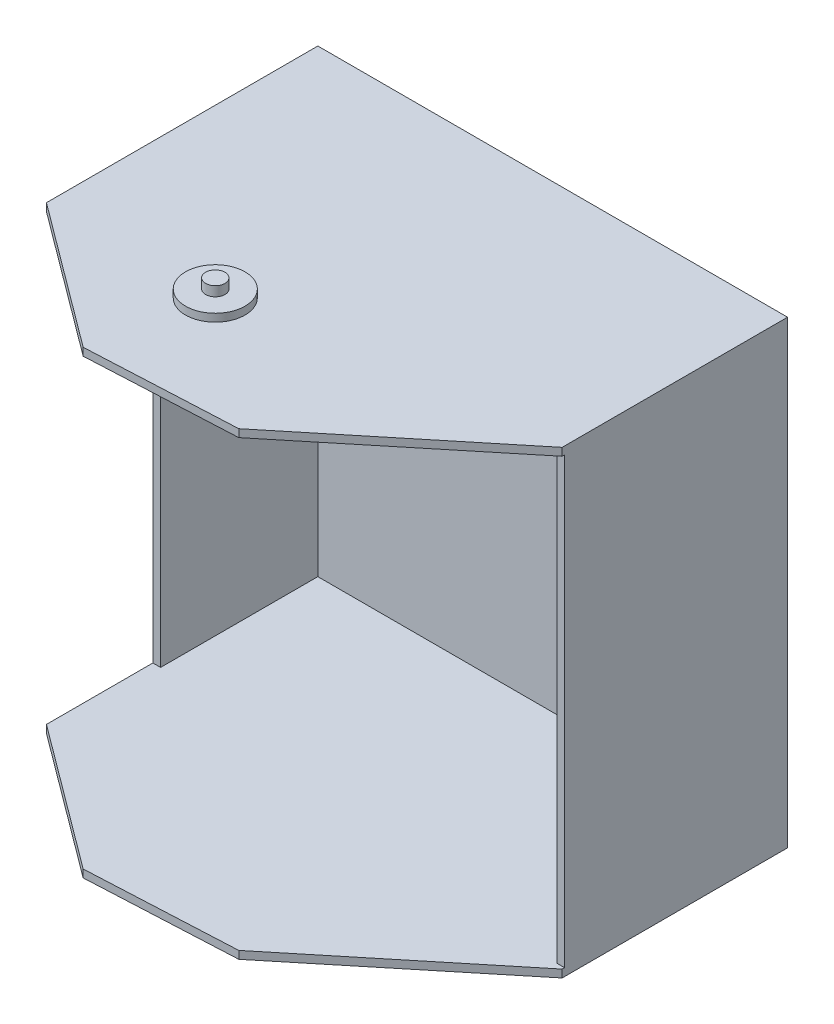
ISO-10303-21;
HEADER;
FILE_DESCRIPTION(('STEP AP214'),'2;1');
FILE_NAME('part.step','',(''),(''),'','','');
FILE_SCHEMA(('AUTOMOTIVE_DESIGN { 1 0 10303 214 1 1 1 1 }'));
ENDSEC;
DATA;
#1=APPLICATION_CONTEXT('core data for automotive mechanical design processes');
#2=APPLICATION_PROTOCOL_DEFINITION('international standard','automotive_design',2000,#1);
#3=PRODUCT_CONTEXT('',#1,'mechanical');
#4=PRODUCT('Part','Part','',(#3));
#5=PRODUCT_RELATED_PRODUCT_CATEGORY('part','',(#4));
#6=PRODUCT_DEFINITION_FORMATION('','',#4);
#7=PRODUCT_DEFINITION_CONTEXT('part definition',#1,'design');
#8=PRODUCT_DEFINITION('design','',#6,#7);
#9=PRODUCT_DEFINITION_SHAPE('','',#8);
#10=(LENGTH_UNIT() NAMED_UNIT(*) SI_UNIT(.MILLI.,.METRE.));
#11=(NAMED_UNIT(*) PLANE_ANGLE_UNIT() SI_UNIT($,.RADIAN.));
#12=(NAMED_UNIT(*) SI_UNIT($,.STERADIAN.) SOLID_ANGLE_UNIT());
#13=UNCERTAINTY_MEASURE_WITH_UNIT(LENGTH_MEASURE(1.E-05),#10,'distance_accuracy_value','');
#14=(GEOMETRIC_REPRESENTATION_CONTEXT(3) GLOBAL_UNCERTAINTY_ASSIGNED_CONTEXT((#13)) GLOBAL_UNIT_ASSIGNED_CONTEXT((#10,
#11,#12)) REPRESENTATION_CONTEXT('',''));
#15=CARTESIAN_POINT('',(0.,0.,0.));
#16=DIRECTION('',(0.,0.,1.));
#17=DIRECTION('',(1.,0.,0.));
#18=AXIS2_PLACEMENT_3D('',#15,#16,#17);
#19=CARTESIAN_POINT('',(-71.1992979722016,190.,65.));
#20=DIRECTION('',(0.,0.,-1.));
#21=DIRECTION('',(-1.,0.,0.));
#22=AXIS2_PLACEMENT_3D('',#19,#20,#21);
#23=PLANE('',#22);
#24=DIRECTION('',(-1.,0.,0.));
#25=VECTOR('',#24,1.);
#26=CARTESIAN_POINT('',(-74.3992979722016,186.8,65.));
#27=LINE('',#26,#25);
#28=CARTESIAN_POINT('',(-71.1992979722016,186.8,65.));
#29=VERTEX_POINT('',#28);
#30=CARTESIAN_POINT('',(-74.3992979722016,186.8,65.));
#31=VERTEX_POINT('',#30);
#32=EDGE_CURVE('E237',#29,#31,#27,.T.);
#33=ORIENTED_EDGE('',*,*,#32,.T.);
#34=DIRECTION('',(0.,-1.,0.));
#35=VECTOR('',#34,1.);
#36=CARTESIAN_POINT('',(-74.3992979722016,190.,65.));
#37=LINE('',#36,#35);
#38=CARTESIAN_POINT('',(-74.3992979722016,3.2,65.));
#39=VERTEX_POINT('',#38);
#40=EDGE_CURVE('E280',#31,#39,#37,.T.);
#41=ORIENTED_EDGE('',*,*,#40,.T.);
#42=DIRECTION('',(-1.,0.,0.));
#43=VECTOR('',#42,1.);
#44=CARTESIAN_POINT('',(-74.3992979722016,3.2,65.));
#45=LINE('',#44,#43);
#46=CARTESIAN_POINT('',(-71.1992979722016,3.2,65.));
#47=VERTEX_POINT('',#46);
#48=EDGE_CURVE('E163',#47,#39,#45,.T.);
#49=ORIENTED_EDGE('',*,*,#48,.F.);
#50=DIRECTION('',(0.,-1.,0.));
#51=VECTOR('',#50,1.);
#52=CARTESIAN_POINT('',(-71.1992979722016,190.,65.));
#53=LINE('',#52,#51);
#54=EDGE_CURVE('E88',#29,#47,#53,.T.);
#55=ORIENTED_EDGE('',*,*,#54,.F.);
#56=EDGE_LOOP('',(#33,#41,#49,#55));
#57=FACE_BOUND('',#56,.T.);
#58=ADVANCED_FACE('F32',(#57),#23,.F.);
#59=CARTESIAN_POINT('',(-71.1992979722016,190.,0.));
#60=DIRECTION('',(-1.,0.,0.));
#61=DIRECTION('',(0.,0.,1.));
#62=AXIS2_PLACEMENT_3D('',#59,#60,#61);
#63=PLANE('',#62);
#64=DIRECTION('',(0.,0.,1.));
#65=VECTOR('',#64,1.);
#66=CARTESIAN_POINT('',(-71.1992979722016,186.8,65.));
#67=LINE('',#66,#65);
#68=CARTESIAN_POINT('',(-71.1992979722016,186.8,0.));
#69=VERTEX_POINT('',#68);
#70=EDGE_CURVE('E217',#69,#29,#67,.T.);
#71=ORIENTED_EDGE('',*,*,#70,.T.);
#72=ORIENTED_EDGE('',*,*,#54,.T.);
#73=DIRECTION('',(0.,0.,1.));
#74=VECTOR('',#73,1.);
#75=CARTESIAN_POINT('',(-71.1992979722016,3.2,65.));
#76=LINE('',#75,#74);
#77=CARTESIAN_POINT('',(-71.1992979722016,3.2,0.));
#78=VERTEX_POINT('',#77);
#79=EDGE_CURVE('E142',#78,#47,#76,.T.);
#80=ORIENTED_EDGE('',*,*,#79,.F.);
#81=DIRECTION('',(0.,-1.,0.));
#82=VECTOR('',#81,1.);
#83=CARTESIAN_POINT('',(-71.1992979722016,190.,0.));
#84=LINE('',#83,#82);
#85=EDGE_CURVE('E56',#69,#78,#84,.T.);
#86=ORIENTED_EDGE('',*,*,#85,.F.);
#87=EDGE_LOOP('',(#71,#72,#80,#86));
#88=FACE_BOUND('',#87,.T.);
#89=ADVANCED_FACE('F301',(#88),#63,.F.);
#90=CARTESIAN_POINT('',(116.600702027798,190.,0.));
#91=DIRECTION('',(1.,0.,0.));
#92=DIRECTION('',(0.,0.,-1.));
#93=AXIS2_PLACEMENT_3D('',#90,#91,#92);
#94=PLANE('',#93);
#95=DIRECTION('',(0.,0.,1.));
#96=VECTOR('',#95,1.);
#97=CARTESIAN_POINT('',(116.600702027798,186.8,0.));
#98=LINE('',#97,#96);
#99=CARTESIAN_POINT('',(116.600702027798,186.8,0.));
#100=VERTEX_POINT('',#99);
#101=CARTESIAN_POINT('',(116.600702027798,186.8,89.));
#102=VERTEX_POINT('',#101);
#103=EDGE_CURVE('E259',#100,#102,#98,.T.);
#104=ORIENTED_EDGE('',*,*,#103,.F.);
#105=DIRECTION('',(0.,-1.,0.));
#106=VECTOR('',#105,1.);
#107=CARTESIAN_POINT('',(116.600702027798,190.,0.));
#108=LINE('',#107,#106);
#109=CARTESIAN_POINT('',(116.600702027798,3.2,0.));
#110=VERTEX_POINT('',#109);
#111=EDGE_CURVE('E269',#100,#110,#108,.T.);
#112=ORIENTED_EDGE('',*,*,#111,.T.);
#113=DIRECTION('',(0.,0.,1.));
#114=VECTOR('',#113,1.);
#115=CARTESIAN_POINT('',(116.600702027798,3.2,0.));
#116=LINE('',#115,#114);
#117=CARTESIAN_POINT('',(116.600702027798,3.2,89.));
#118=VERTEX_POINT('',#117);
#119=EDGE_CURVE('E274',#110,#118,#116,.T.);
#120=ORIENTED_EDGE('',*,*,#119,.T.);
#121=DIRECTION('',(0.,-1.,0.));
#122=VECTOR('',#121,1.);
#123=CARTESIAN_POINT('',(116.600702027798,190.,89.));
#124=LINE('',#123,#122);
#125=EDGE_CURVE('E47',#102,#118,#124,.T.);
#126=ORIENTED_EDGE('',*,*,#125,.F.);
#127=EDGE_LOOP('',(#104,#112,#120,#126));
#128=FACE_BOUND('',#127,.T.);
#129=ADVANCED_FACE('F308',(#128),#94,.F.);
#130=CARTESIAN_POINT('',(116.600702027798,190.,89.));
#131=DIRECTION('',(0.,0.,-1.));
#132=DIRECTION('',(-1.,0.,0.));
#133=AXIS2_PLACEMENT_3D('',#130,#131,#132);
#134=PLANE('',#133);
#135=DIRECTION('',(1.,0.,0.));
#136=VECTOR('',#135,1.);
#137=CARTESIAN_POINT('',(116.600702027798,186.8,89.));
#138=LINE('',#137,#136);
#139=CARTESIAN_POINT('',(119.800702027798,186.8,89.));
#140=VERTEX_POINT('',#139);
#141=EDGE_CURVE('E11',#102,#140,#138,.T.);
#142=ORIENTED_EDGE('',*,*,#141,.F.);
#143=ORIENTED_EDGE('',*,*,#125,.T.);
#144=DIRECTION('',(1.,0.,0.));
#145=VECTOR('',#144,1.);
#146=CARTESIAN_POINT('',(0.,3.2,89.));
#147=LINE('',#146,#145);
#148=CARTESIAN_POINT('',(119.800702027798,3.20000000000001,89.));
#149=VERTEX_POINT('',#148);
#150=EDGE_CURVE('E272',#118,#149,#147,.T.);
#151=ORIENTED_EDGE('',*,*,#150,.T.);
#152=DIRECTION('',(0.,-1.,0.));
#153=VECTOR('',#152,1.);
#154=CARTESIAN_POINT('',(119.800702027798,190.,89.));
#155=LINE('',#154,#153);
#156=EDGE_CURVE('E265',#140,#149,#155,.T.);
#157=ORIENTED_EDGE('',*,*,#156,.F.);
#158=EDGE_LOOP('',(#142,#143,#151,#157));
#159=FACE_BOUND('',#158,.T.);
#160=ADVANCED_FACE('F317',(#159),#134,.F.);
#161=CARTESIAN_POINT('',(0.,3.2,0.));
#162=DIRECTION('',(0.,-1.,0.));
#163=DIRECTION('',(0.,0.,-1.));
#164=AXIS2_PLACEMENT_3D('',#161,#162,#163);
#165=PLANE('',#164);
#166=ORIENTED_EDGE('',*,*,#119,.F.);
#167=DIRECTION('',(-1.,0.,0.));
#168=VECTOR('',#167,1.);
#169=CARTESIAN_POINT('',(-71.1992979722016,3.2,0.));
#170=LINE('',#169,#168);
#171=EDGE_CURVE('E127',#110,#78,#170,.T.);
#172=ORIENTED_EDGE('',*,*,#171,.T.);
#173=ORIENTED_EDGE('',*,*,#79,.T.);
#174=ORIENTED_EDGE('',*,*,#48,.T.);
#175=DIRECTION('',(0.,0.,1.));
#176=VECTOR('',#175,1.);
#177=CARTESIAN_POINT('',(-74.3992979722016,3.2,109.));
#178=LINE('',#177,#176);
#179=CARTESIAN_POINT('',(-74.3992979722016,3.2,109.));
#180=VERTEX_POINT('',#179);
#181=EDGE_CURVE('E166',#39,#180,#178,.T.);
#182=ORIENTED_EDGE('',*,*,#181,.T.);
#183=DIRECTION('',(0.802210362931271,0.,0.597041483990583));
#184=VECTOR('',#183,1.);
#185=CARTESIAN_POINT('',(-15.0357311152875,3.2,153.181069815303));
#186=LINE('',#185,#184);
#187=CARTESIAN_POINT('',(-15.0357311152875,3.2,153.181069815303));
#188=VERTEX_POINT('',#187);
#189=EDGE_CURVE('E111',#180,#188,#186,.T.);
#190=ORIENTED_EDGE('',*,*,#189,.T.);
#191=DIRECTION('',(0.998784397084784,0.,-0.0492922726193887));
#192=VECTOR('',#191,1.);
#193=CARTESIAN_POINT('',(46.2729248544923,3.2,150.155348755972));
#194=LINE('',#193,#192);
#195=CARTESIAN_POINT('',(46.2729248544923,3.2,150.155348755972));
#196=VERTEX_POINT('',#195);
#197=EDGE_CURVE('E103',#188,#196,#194,.T.);
#198=ORIENTED_EDGE('',*,*,#197,.T.);
#199=DIRECTION('',(0.773976601824276,0.,-0.633214197431285));
#200=VECTOR('',#199,1.);
#201=CARTESIAN_POINT('',(119.800702027798,3.2,90.));
#202=LINE('',#201,#200);
#203=CARTESIAN_POINT('',(119.800702027798,3.2,90.));
#204=VERTEX_POINT('',#203);
#205=EDGE_CURVE('E109',#196,#204,#202,.T.);
#206=ORIENTED_EDGE('',*,*,#205,.T.);
#207=DIRECTION('',(0.,0.,-1.));
#208=VECTOR('',#207,1.);
#209=CARTESIAN_POINT('',(119.800702027798,3.2,0.));
#210=LINE('',#209,#208);
#211=EDGE_CURVE('E125',#204,#149,#210,.T.);
#212=ORIENTED_EDGE('',*,*,#211,.T.);
#213=ORIENTED_EDGE('',*,*,#150,.F.);
#214=EDGE_LOOP('',(#166,#172,#173,#174,#182,#190,#198,#206,#212,#213));
#215=FACE_BOUND('',#214,.T.);
#216=ADVANCED_FACE('F106',(#215),#165,.F.);
#217=CARTESIAN_POINT('',(-74.3992979722016,3.2,109.));
#218=DIRECTION('',(1.,0.,0.));
#219=DIRECTION('',(0.,0.,-1.));
#220=AXIS2_PLACEMENT_3D('',#217,#218,#219);
#221=PLANE('',#220);
#222=DIRECTION('',(0.,0.,1.));
#223=VECTOR('',#222,1.);
#224=CARTESIAN_POINT('',(-74.3992979722016,0.,109.));
#225=LINE('',#224,#223);
#226=CARTESIAN_POINT('',(-74.3992979722016,0.,-3.2));
#227=VERTEX_POINT('',#226);
#228=CARTESIAN_POINT('',(-74.3992979722016,0.,109.));
#229=VERTEX_POINT('',#228);
#230=EDGE_CURVE('E132',#227,#229,#225,.T.);
#231=ORIENTED_EDGE('',*,*,#230,.T.);
#232=DIRECTION('',(0.,-1.,0.));
#233=VECTOR('',#232,1.);
#234=CARTESIAN_POINT('',(-74.3992979722016,3.2,109.));
#235=LINE('',#234,#233);
#236=EDGE_CURVE('E144',#180,#229,#235,.T.);
#237=ORIENTED_EDGE('',*,*,#236,.F.);
#238=ORIENTED_EDGE('',*,*,#181,.F.);
#239=ORIENTED_EDGE('',*,*,#40,.F.);
#240=DIRECTION('',(0.,0.,1.));
#241=VECTOR('',#240,1.);
#242=CARTESIAN_POINT('',(-74.3992979722016,186.8,109.));
#243=LINE('',#242,#241);
#244=CARTESIAN_POINT('',(-74.3992979722016,186.8,109.));
#245=VERTEX_POINT('',#244);
#246=EDGE_CURVE('E234',#31,#245,#243,.T.);
#247=ORIENTED_EDGE('',*,*,#246,.T.);
#248=DIRECTION('',(0.,1.,0.));
#249=VECTOR('',#248,1.);
#250=CARTESIAN_POINT('',(-74.3992979722016,186.8,109.));
#251=LINE('',#250,#249);
#252=CARTESIAN_POINT('',(-74.3992979722016,190.,109.));
#253=VERTEX_POINT('',#252);
#254=EDGE_CURVE('E240',#245,#253,#251,.T.);
#255=ORIENTED_EDGE('',*,*,#254,.T.);
#256=DIRECTION('',(0.,0.,1.));
#257=VECTOR('',#256,1.);
#258=CARTESIAN_POINT('',(-74.3992979722016,190.,65.));
#259=LINE('',#258,#257);
#260=CARTESIAN_POINT('',(-74.3992979722016,190.,-3.2));
#261=VERTEX_POINT('',#260);
#262=EDGE_CURVE('E277',#261,#253,#259,.T.);
#263=ORIENTED_EDGE('',*,*,#262,.F.);
#264=DIRECTION('',(0.,-1.,0.));
#265=VECTOR('',#264,1.);
#266=CARTESIAN_POINT('',(-74.3992979722016,0.,-3.2));
#267=LINE('',#266,#265);
#268=EDGE_CURVE('E199',#261,#227,#267,.T.);
#269=ORIENTED_EDGE('',*,*,#268,.T.);
#270=EDGE_LOOP('',(#231,#237,#238,#239,#247,#255,#263,#269));
#271=FACE_BOUND('',#270,.T.);
#272=ADVANCED_FACE('F34',(#271),#221,.F.);
#273=CARTESIAN_POINT('',(-15.0357311152875,3.2,153.181069815303));
#274=DIRECTION('',(0.597041483990583,0.,-0.802210362931271));
#275=DIRECTION('',(-0.802210362931272,0.,-0.597041483990583));
#276=AXIS2_PLACEMENT_3D('',#273,#274,#275);
#277=PLANE('',#276);
#278=DIRECTION('',(0.802210362931271,0.,0.597041483990583));
#279=VECTOR('',#278,1.);
#280=CARTESIAN_POINT('',(-15.0357311152875,0.,153.181069815303));
#281=LINE('',#280,#279);
#282=CARTESIAN_POINT('',(-15.0357311152875,0.,153.181069815303));
#283=VERTEX_POINT('',#282);
#284=EDGE_CURVE('E134',#229,#283,#281,.T.);
#285=ORIENTED_EDGE('',*,*,#284,.T.);
#286=DIRECTION('',(0.,-1.,0.));
#287=VECTOR('',#286,1.);
#288=CARTESIAN_POINT('',(-15.0357311152875,3.2,153.181069815303));
#289=LINE('',#288,#287);
#290=EDGE_CURVE('E120',#188,#283,#289,.T.);
#291=ORIENTED_EDGE('',*,*,#290,.F.);
#292=ORIENTED_EDGE('',*,*,#189,.F.);
#293=ORIENTED_EDGE('',*,*,#236,.T.);
#294=EDGE_LOOP('',(#285,#291,#292,#293));
#295=FACE_BOUND('',#294,.T.);
#296=ADVANCED_FACE('F173',(#295),#277,.F.);
#297=CARTESIAN_POINT('',(46.2729248544923,3.2,150.155348755972));
#298=DIRECTION('',(-0.0492922726193887,0.,-0.998784397084784));
#299=DIRECTION('',(-0.998784397084784,0.,0.0492922726193887));
#300=AXIS2_PLACEMENT_3D('',#297,#298,#299);
#301=PLANE('',#300);
#302=DIRECTION('',(0.998784397084784,0.,-0.0492922726193887));
#303=VECTOR('',#302,1.);
#304=CARTESIAN_POINT('',(46.2729248544923,0.,150.155348755972));
#305=LINE('',#304,#303);
#306=CARTESIAN_POINT('',(46.2729248544923,0.,150.155348755972));
#307=VERTEX_POINT('',#306);
#308=EDGE_CURVE('E119',#283,#307,#305,.T.);
#309=ORIENTED_EDGE('',*,*,#308,.T.);
#310=DIRECTION('',(0.,-1.,0.));
#311=VECTOR('',#310,1.);
#312=CARTESIAN_POINT('',(46.2729248544923,3.2,150.155348755972));
#313=LINE('',#312,#311);
#314=EDGE_CURVE('E116',#196,#307,#313,.T.);
#315=ORIENTED_EDGE('',*,*,#314,.F.);
#316=ORIENTED_EDGE('',*,*,#197,.F.);
#317=ORIENTED_EDGE('',*,*,#290,.T.);
#318=EDGE_LOOP('',(#309,#315,#316,#317));
#319=FACE_BOUND('',#318,.T.);
#320=ADVANCED_FACE('F117',(#319),#301,.F.);
#321=CARTESIAN_POINT('',(119.800702027798,3.2,90.));
#322=DIRECTION('',(-0.633214197431285,0.,-0.773976601824276));
#323=DIRECTION('',(-0.773976601824276,0.,0.633214197431285));
#324=AXIS2_PLACEMENT_3D('',#321,#322,#323);
#325=PLANE('',#324);
#326=DIRECTION('',(0.773976601824276,0.,-0.633214197431285));
#327=VECTOR('',#326,1.);
#328=CARTESIAN_POINT('',(119.800702027798,0.,90.));
#329=LINE('',#328,#327);
#330=CARTESIAN_POINT('',(119.800702027798,0.,90.));
#331=VERTEX_POINT('',#330);
#332=EDGE_CURVE('E79',#307,#331,#329,.T.);
#333=ORIENTED_EDGE('',*,*,#332,.T.);
#334=DIRECTION('',(0.,-1.,0.));
#335=VECTOR('',#334,1.);
#336=CARTESIAN_POINT('',(119.800702027798,3.2,90.));
#337=LINE('',#336,#335);
#338=EDGE_CURVE('E121',#204,#331,#337,.T.);
#339=ORIENTED_EDGE('',*,*,#338,.F.);
#340=ORIENTED_EDGE('',*,*,#205,.F.);
#341=ORIENTED_EDGE('',*,*,#314,.T.);
#342=EDGE_LOOP('',(#333,#339,#340,#341));
#343=FACE_BOUND('',#342,.T.);
#344=ADVANCED_FACE('F123',(#343),#325,.F.);
#345=CARTESIAN_POINT('',(119.800702027798,3.2,0.));
#346=DIRECTION('',(-1.,0.,0.));
#347=DIRECTION('',(0.,0.,1.));
#348=AXIS2_PLACEMENT_3D('',#345,#346,#347);
#349=PLANE('',#348);
#350=DIRECTION('',(0.,0.,-1.));
#351=VECTOR('',#350,1.);
#352=CARTESIAN_POINT('',(119.800702027798,190.,89.));
#353=LINE('',#352,#351);
#354=CARTESIAN_POINT('',(119.800702027798,190.,90.));
#355=VERTEX_POINT('',#354);
#356=CARTESIAN_POINT('',(119.800702027798,190.,-3.2));
#357=VERTEX_POINT('',#356);
#358=EDGE_CURVE('E262',#355,#357,#353,.T.);
#359=ORIENTED_EDGE('',*,*,#358,.F.);
#360=DIRECTION('',(0.,1.,0.));
#361=VECTOR('',#360,1.);
#362=CARTESIAN_POINT('',(119.800702027798,186.8,90.));
#363=LINE('',#362,#361);
#364=CARTESIAN_POINT('',(119.800702027798,186.8,90.));
#365=VERTEX_POINT('',#364);
#366=EDGE_CURVE('E256',#365,#355,#363,.T.);
#367=ORIENTED_EDGE('',*,*,#366,.F.);
#368=DIRECTION('',(0.,0.,-1.));
#369=VECTOR('',#368,1.);
#370=CARTESIAN_POINT('',(119.800702027798,186.8,0.));
#371=LINE('',#370,#369);
#372=EDGE_CURVE('E222',#365,#140,#371,.T.);
#373=ORIENTED_EDGE('',*,*,#372,.T.);
#374=ORIENTED_EDGE('',*,*,#156,.T.);
#375=ORIENTED_EDGE('',*,*,#211,.F.);
#376=ORIENTED_EDGE('',*,*,#338,.T.);
#377=DIRECTION('',(0.,0.,-1.));
#378=VECTOR('',#377,1.);
#379=CARTESIAN_POINT('',(119.800702027798,0.,0.));
#380=LINE('',#379,#378);
#381=CARTESIAN_POINT('',(119.800702027798,0.,-3.2));
#382=VERTEX_POINT('',#381);
#383=EDGE_CURVE('E139',#331,#382,#380,.T.);
#384=ORIENTED_EDGE('',*,*,#383,.T.);
#385=DIRECTION('',(0.,1.,0.));
#386=VECTOR('',#385,1.);
#387=CARTESIAN_POINT('',(119.800702027798,0.,-3.2));
#388=LINE('',#387,#386);
#389=EDGE_CURVE('E188',#382,#357,#388,.T.);
#390=ORIENTED_EDGE('',*,*,#389,.T.);
#391=EDGE_LOOP('',(#359,#367,#373,#374,#375,#376,#384,#390));
#392=FACE_BOUND('',#391,.T.);
#393=ADVANCED_FACE('F186',(#392),#349,.F.);
#394=CARTESIAN_POINT('',(0.,0.,0.));
#395=DIRECTION('',(0.,-1.,0.));
#396=DIRECTION('',(0.,0.,-1.));
#397=AXIS2_PLACEMENT_3D('',#394,#395,#396);
#398=PLANE('',#397);
#399=ORIENTED_EDGE('',*,*,#230,.F.);
#400=DIRECTION('',(1.,0.,0.));
#401=VECTOR('',#400,1.);
#402=CARTESIAN_POINT('',(-74.3992979722016,0.,-3.2));
#403=LINE('',#402,#401);
#404=EDGE_CURVE('E181',#227,#382,#403,.T.);
#405=ORIENTED_EDGE('',*,*,#404,.T.);
#406=ORIENTED_EDGE('',*,*,#383,.F.);
#407=ORIENTED_EDGE('',*,*,#332,.F.);
#408=ORIENTED_EDGE('',*,*,#308,.F.);
#409=ORIENTED_EDGE('',*,*,#284,.F.);
#410=EDGE_LOOP('',(#399,#405,#406,#407,#408,#409));
#411=FACE_BOUND('',#410,.T.);
#412=CARTESIAN_POINT('',(-5.39929797220156,0.,108.199281836625));
#413=DIRECTION('',(0.,-1.,0.));
#414=DIRECTION('',(0.,0.,-1.));
#415=AXIS2_PLACEMENT_3D('',#412,#413,#414);
#416=CIRCLE('',#415,12.3);
#417=CARTESIAN_POINT('',(-5.39929797220156,0.,95.8992818366245));
#418=VERTEX_POINT('',#417);
#419=EDGE_CURVE('E159',#418,#418,#416,.T.);
#420=ORIENTED_EDGE('',*,*,#419,.F.);
#421=EDGE_LOOP('',(#420));
#422=FACE_BOUND('',#421,.T.);
#423=ADVANCED_FACE('F175',(#411,#422),#398,.T.);
#424=CARTESIAN_POINT('',(-5.39929797220156,-3.2,108.199281836625));
#425=DIRECTION('',(0.,1.,0.));
#426=DIRECTION('',(0.,0.,1.));
#427=AXIS2_PLACEMENT_3D('',#424,#425,#426);
#428=CYLINDRICAL_SURFACE('',#427,12.3);
#429=CARTESIAN_POINT('',(-5.39929797220156,-3.2,108.199281836625));
#430=DIRECTION('',(0.,-1.,0.));
#431=DIRECTION('',(0.,0.,-1.));
#432=AXIS2_PLACEMENT_3D('',#429,#430,#431);
#433=CIRCLE('',#432,12.3);
#434=CARTESIAN_POINT('',(-5.39929797220156,-3.2,95.8992818366245));
#435=VERTEX_POINT('',#434);
#436=EDGE_CURVE('E135',#435,#435,#433,.T.);
#437=ORIENTED_EDGE('',*,*,#436,.F.);
#438=EDGE_LOOP('',(#437));
#439=FACE_BOUND('',#438,.T.);
#440=ORIENTED_EDGE('',*,*,#419,.T.);
#441=EDGE_LOOP('',(#440));
#442=FACE_BOUND('',#441,.T.);
#443=ADVANCED_FACE('F297',(#439,#442),#428,.T.);
#444=CARTESIAN_POINT('',(-5.39929797220156,-3.2,108.199281836625));
#445=DIRECTION('',(0.,-1.,0.));
#446=DIRECTION('',(0.,0.,-1.));
#447=AXIS2_PLACEMENT_3D('',#444,#445,#446);
#448=PLANE('',#447);
#449=CARTESIAN_POINT('',(-5.39929797220156,-3.2,108.199281836625));
#450=DIRECTION('',(0.,-1.,0.));
#451=DIRECTION('',(0.,0.,-1.));
#452=AXIS2_PLACEMENT_3D('',#449,#450,#451);
#453=CIRCLE('',#452,4.);
#454=CARTESIAN_POINT('',(-5.39929797220156,-3.2,104.199281836625));
#455=VERTEX_POINT('',#454);
#456=EDGE_CURVE('E40',#455,#455,#453,.T.);
#457=ORIENTED_EDGE('',*,*,#456,.F.);
#458=EDGE_LOOP('',(#457));
#459=FACE_BOUND('',#458,.T.);
#460=ORIENTED_EDGE('',*,*,#436,.T.);
#461=EDGE_LOOP('',(#460));
#462=FACE_BOUND('',#461,.T.);
#463=ADVANCED_FACE('F289',(#459,#462),#448,.T.);
#464=CARTESIAN_POINT('',(-5.39929797220156,-7.2,108.199281836625));
#465=DIRECTION('',(0.,1.,0.));
#466=DIRECTION('',(0.,0.,1.));
#467=AXIS2_PLACEMENT_3D('',#464,#465,#466);
#468=CYLINDRICAL_SURFACE('',#467,4.);
#469=CARTESIAN_POINT('',(-5.39929797220156,-7.2,108.199281836625));
#470=DIRECTION('',(0.,-1.,0.));
#471=DIRECTION('',(0.,0.,-1.));
#472=AXIS2_PLACEMENT_3D('',#469,#470,#471);
#473=CIRCLE('',#472,4.);
#474=CARTESIAN_POINT('',(-5.39929797220156,-7.2,104.199281836625));
#475=VERTEX_POINT('',#474);
#476=EDGE_CURVE('E155',#475,#475,#473,.T.);
#477=ORIENTED_EDGE('',*,*,#476,.F.);
#478=EDGE_LOOP('',(#477));
#479=FACE_BOUND('',#478,.T.);
#480=ORIENTED_EDGE('',*,*,#456,.T.);
#481=EDGE_LOOP('',(#480));
#482=FACE_BOUND('',#481,.T.);
#483=ADVANCED_FACE('F287',(#479,#482),#468,.T.);
#484=CARTESIAN_POINT('',(-5.39929797220156,-7.2,108.199281836625));
#485=DIRECTION('',(0.,-1.,0.));
#486=DIRECTION('',(0.,0.,-1.));
#487=AXIS2_PLACEMENT_3D('',#484,#485,#486);
#488=PLANE('',#487);
#489=ORIENTED_EDGE('',*,*,#476,.T.);
#490=EDGE_LOOP('',(#489));
#491=FACE_BOUND('',#490,.T.);
#492=ADVANCED_FACE('F285',(#491),#488,.T.);
#493=CARTESIAN_POINT('',(0.,190.,0.));
#494=DIRECTION('',(0.,-1.,0.));
#495=DIRECTION('',(0.,0.,-1.));
#496=AXIS2_PLACEMENT_3D('',#493,#494,#495);
#497=PLANE('',#496);
#498=CARTESIAN_POINT('',(-5.39929797220156,190.,108.199281836625));
#499=DIRECTION('',(0.,-1.,0.));
#500=DIRECTION('',(0.,0.,-1.));
#501=AXIS2_PLACEMENT_3D('',#498,#499,#500);
#502=CIRCLE('',#501,12.3);
#503=CARTESIAN_POINT('',(-5.39929797220156,190.,95.8992818366245));
#504=VERTEX_POINT('',#503);
#505=EDGE_CURVE('E208',#504,#504,#502,.T.);
#506=ORIENTED_EDGE('',*,*,#505,.T.);
#507=EDGE_LOOP('',(#506));
#508=FACE_BOUND('',#507,.T.);
#509=ORIENTED_EDGE('',*,*,#358,.T.);
#510=DIRECTION('',(-1.,0.,0.));
#511=VECTOR('',#510,1.);
#512=CARTESIAN_POINT('',(-74.3992979722016,190.,-3.2));
#513=LINE('',#512,#511);
#514=EDGE_CURVE('E197',#357,#261,#513,.T.);
#515=ORIENTED_EDGE('',*,*,#514,.T.);
#516=ORIENTED_EDGE('',*,*,#262,.T.);
#517=DIRECTION('',(0.802210362931271,0.,0.597041483990583));
#518=VECTOR('',#517,1.);
#519=CARTESIAN_POINT('',(-15.0357311152875,190.,153.181069815303));
#520=LINE('',#519,#518);
#521=CARTESIAN_POINT('',(-15.0357311152875,190.,153.181069815303));
#522=VERTEX_POINT('',#521);
#523=EDGE_CURVE('E220',#253,#522,#520,.T.);
#524=ORIENTED_EDGE('',*,*,#523,.T.);
#525=DIRECTION('',(0.998784397084784,0.,-0.0492922726193887));
#526=VECTOR('',#525,1.);
#527=CARTESIAN_POINT('',(46.2729248544923,190.,150.155348755972));
#528=LINE('',#527,#526);
#529=CARTESIAN_POINT('',(46.2729248544923,190.,150.155348755972));
#530=VERTEX_POINT('',#529);
#531=EDGE_CURVE('E243',#522,#530,#528,.T.);
#532=ORIENTED_EDGE('',*,*,#531,.T.);
#533=DIRECTION('',(0.773976601824276,0.,-0.633214197431285));
#534=VECTOR('',#533,1.);
#535=CARTESIAN_POINT('',(119.800702027798,190.,90.));
#536=LINE('',#535,#534);
#537=EDGE_CURVE('E214',#530,#355,#536,.T.);
#538=ORIENTED_EDGE('',*,*,#537,.T.);
#539=EDGE_LOOP('',(#509,#515,#516,#524,#532,#538));
#540=FACE_BOUND('',#539,.T.);
#541=ADVANCED_FACE('F295',(#508,#540),#497,.F.);
#542=CARTESIAN_POINT('',(0.,186.8,0.));
#543=DIRECTION('',(0.,1.,0.));
#544=DIRECTION('',(0.,0.,-1.));
#545=AXIS2_PLACEMENT_3D('',#542,#543,#544);
#546=PLANE('',#545);
#547=DIRECTION('',(-1.,0.,0.));
#548=VECTOR('',#547,1.);
#549=CARTESIAN_POINT('',(-71.1992979722016,186.8,0.));
#550=LINE('',#549,#548);
#551=EDGE_CURVE('E219',#100,#69,#550,.T.);
#552=ORIENTED_EDGE('',*,*,#551,.F.);
#553=ORIENTED_EDGE('',*,*,#103,.T.);
#554=ORIENTED_EDGE('',*,*,#141,.T.);
#555=ORIENTED_EDGE('',*,*,#372,.F.);
#556=DIRECTION('',(0.773976601824276,0.,-0.633214197431285));
#557=VECTOR('',#556,1.);
#558=CARTESIAN_POINT('',(119.800702027798,186.8,90.));
#559=LINE('',#558,#557);
#560=CARTESIAN_POINT('',(46.2729248544923,186.8,150.155348755972));
#561=VERTEX_POINT('',#560);
#562=EDGE_CURVE('E225',#561,#365,#559,.T.);
#563=ORIENTED_EDGE('',*,*,#562,.F.);
#564=DIRECTION('',(0.998784397084784,0.,-0.0492922726193887));
#565=VECTOR('',#564,1.);
#566=CARTESIAN_POINT('',(46.2729248544923,186.8,150.155348755972));
#567=LINE('',#566,#565);
#568=CARTESIAN_POINT('',(-15.0357311152875,186.8,153.181069815303));
#569=VERTEX_POINT('',#568);
#570=EDGE_CURVE('E228',#569,#561,#567,.T.);
#571=ORIENTED_EDGE('',*,*,#570,.F.);
#572=DIRECTION('',(0.802210362931271,0.,0.597041483990583));
#573=VECTOR('',#572,1.);
#574=CARTESIAN_POINT('',(-15.0357311152875,186.8,153.181069815303));
#575=LINE('',#574,#573);
#576=EDGE_CURVE('E231',#245,#569,#575,.T.);
#577=ORIENTED_EDGE('',*,*,#576,.F.);
#578=ORIENTED_EDGE('',*,*,#246,.F.);
#579=ORIENTED_EDGE('',*,*,#32,.F.);
#580=ORIENTED_EDGE('',*,*,#70,.F.);
#581=EDGE_LOOP('',(#552,#553,#554,#555,#563,#571,#577,#578,#579,#580));
#582=FACE_BOUND('',#581,.T.);
#583=ADVANCED_FACE('F313',(#582),#546,.F.);
#584=CARTESIAN_POINT('',(119.800702027798,186.8,90.));
#585=DIRECTION('',(0.633214197431285,0.,0.773976601824276));
#586=DIRECTION('',(0.773976601824276,0.,-0.633214197431285));
#587=AXIS2_PLACEMENT_3D('',#584,#585,#586);
#588=PLANE('',#587);
#589=ORIENTED_EDGE('',*,*,#537,.F.);
#590=DIRECTION('',(0.,1.,0.));
#591=VECTOR('',#590,1.);
#592=CARTESIAN_POINT('',(46.2729248544923,186.8,150.155348755972));
#593=LINE('',#592,#591);
#594=EDGE_CURVE('E253',#561,#530,#593,.T.);
#595=ORIENTED_EDGE('',*,*,#594,.F.);
#596=ORIENTED_EDGE('',*,*,#562,.T.);
#597=ORIENTED_EDGE('',*,*,#366,.T.);
#598=EDGE_LOOP('',(#589,#595,#596,#597));
#599=FACE_BOUND('',#598,.T.);
#600=ADVANCED_FACE('F321',(#599),#588,.T.);
#601=CARTESIAN_POINT('',(46.2729248544923,186.8,150.155348755972));
#602=DIRECTION('',(0.0492922726193887,0.,0.998784397084784));
#603=DIRECTION('',(0.998784397084784,0.,-0.0492922726193887));
#604=AXIS2_PLACEMENT_3D('',#601,#602,#603);
#605=PLANE('',#604);
#606=ORIENTED_EDGE('',*,*,#531,.F.);
#607=DIRECTION('',(0.,1.,0.));
#608=VECTOR('',#607,1.);
#609=CARTESIAN_POINT('',(-15.0357311152875,186.8,153.181069815303));
#610=LINE('',#609,#608);
#611=EDGE_CURVE('E250',#569,#522,#610,.T.);
#612=ORIENTED_EDGE('',*,*,#611,.F.);
#613=ORIENTED_EDGE('',*,*,#570,.T.);
#614=ORIENTED_EDGE('',*,*,#594,.T.);
#615=EDGE_LOOP('',(#606,#612,#613,#614));
#616=FACE_BOUND('',#615,.T.);
#617=ADVANCED_FACE('F324',(#616),#605,.T.);
#618=CARTESIAN_POINT('',(-15.0357311152875,186.8,153.181069815303));
#619=DIRECTION('',(-0.597041483990583,0.,0.802210362931271));
#620=DIRECTION('',(0.802210362931272,0.,0.597041483990583));
#621=AXIS2_PLACEMENT_3D('',#618,#619,#620);
#622=PLANE('',#621);
#623=ORIENTED_EDGE('',*,*,#523,.F.);
#624=ORIENTED_EDGE('',*,*,#254,.F.);
#625=ORIENTED_EDGE('',*,*,#576,.T.);
#626=ORIENTED_EDGE('',*,*,#611,.T.);
#627=EDGE_LOOP('',(#623,#624,#625,#626));
#628=FACE_BOUND('',#627,.T.);
#629=ADVANCED_FACE('F328',(#628),#622,.T.);
#630=CARTESIAN_POINT('',(-5.39929797220156,193.2,108.199281836625));
#631=DIRECTION('',(0.,-1.,0.));
#632=DIRECTION('',(0.,0.,-1.));
#633=AXIS2_PLACEMENT_3D('',#630,#631,#632);
#634=CYLINDRICAL_SURFACE('',#633,12.3);
#635=CARTESIAN_POINT('',(-5.39929797220156,193.2,108.199281836625));
#636=DIRECTION('',(0.,-1.,0.));
#637=DIRECTION('',(0.,0.,-1.));
#638=AXIS2_PLACEMENT_3D('',#635,#636,#637);
#639=CIRCLE('',#638,12.3);
#640=CARTESIAN_POINT('',(-5.39929797220156,193.2,95.8992818366245));
#641=VERTEX_POINT('',#640);
#642=EDGE_CURVE('E211',#641,#641,#639,.T.);
#643=ORIENTED_EDGE('',*,*,#642,.T.);
#644=EDGE_LOOP('',(#643));
#645=FACE_BOUND('',#644,.T.);
#646=ORIENTED_EDGE('',*,*,#505,.F.);
#647=EDGE_LOOP('',(#646));
#648=FACE_BOUND('',#647,.T.);
#649=ADVANCED_FACE('F332',(#645,#648),#634,.T.);
#650=CARTESIAN_POINT('',(-5.39929797220156,193.2,108.199281836625));
#651=DIRECTION('',(0.,1.,0.));
#652=DIRECTION('',(0.,0.,-1.));
#653=AXIS2_PLACEMENT_3D('',#650,#651,#652);
#654=PLANE('',#653);
#655=CARTESIAN_POINT('',(-5.39929797220156,193.2,108.199281836625));
#656=DIRECTION('',(0.,-1.,0.));
#657=DIRECTION('',(0.,0.,-1.));
#658=AXIS2_PLACEMENT_3D('',#655,#656,#657);
#659=CIRCLE('',#658,4.);
#660=CARTESIAN_POINT('',(-5.39929797220156,193.2,104.199281836625));
#661=VERTEX_POINT('',#660);
#662=EDGE_CURVE('E204',#661,#661,#659,.T.);
#663=ORIENTED_EDGE('',*,*,#662,.T.);
#664=EDGE_LOOP('',(#663));
#665=FACE_BOUND('',#664,.T.);
#666=ORIENTED_EDGE('',*,*,#642,.F.);
#667=EDGE_LOOP('',(#666));
#668=FACE_BOUND('',#667,.T.);
#669=ADVANCED_FACE('F339',(#665,#668),#654,.T.);
#670=CARTESIAN_POINT('',(-5.39929797220156,197.2,108.199281836625));
#671=DIRECTION('',(0.,-1.,0.));
#672=DIRECTION('',(0.,0.,-1.));
#673=AXIS2_PLACEMENT_3D('',#670,#671,#672);
#674=CYLINDRICAL_SURFACE('',#673,4.);
#675=CARTESIAN_POINT('',(-5.39929797220156,197.2,108.199281836625));
#676=DIRECTION('',(0.,-1.,0.));
#677=DIRECTION('',(0.,0.,-1.));
#678=AXIS2_PLACEMENT_3D('',#675,#676,#677);
#679=CIRCLE('',#678,4.);
#680=CARTESIAN_POINT('',(-5.39929797220156,197.2,104.199281836625));
#681=VERTEX_POINT('',#680);
#682=EDGE_CURVE('E205',#681,#681,#679,.T.);
#683=ORIENTED_EDGE('',*,*,#682,.T.);
#684=EDGE_LOOP('',(#683));
#685=FACE_BOUND('',#684,.T.);
#686=ORIENTED_EDGE('',*,*,#662,.F.);
#687=EDGE_LOOP('',(#686));
#688=FACE_BOUND('',#687,.T.);
#689=ADVANCED_FACE('F343',(#685,#688),#674,.T.);
#690=CARTESIAN_POINT('',(-5.39929797220156,197.2,108.199281836625));
#691=DIRECTION('',(0.,1.,0.));
#692=DIRECTION('',(0.,0.,-1.));
#693=AXIS2_PLACEMENT_3D('',#690,#691,#692);
#694=PLANE('',#693);
#695=ORIENTED_EDGE('',*,*,#682,.F.);
#696=EDGE_LOOP('',(#695));
#697=FACE_BOUND('',#696,.T.);
#698=ADVANCED_FACE('F347',(#697),#694,.T.);
#699=CARTESIAN_POINT('',(0.,0.,0.));
#700=DIRECTION('',(0.,0.,-1.));
#701=DIRECTION('',(-1.,0.,0.));
#702=AXIS2_PLACEMENT_3D('',#699,#700,#701);
#703=PLANE('',#702);
#704=ORIENTED_EDGE('',*,*,#111,.F.);
#705=ORIENTED_EDGE('',*,*,#551,.T.);
#706=ORIENTED_EDGE('',*,*,#85,.T.);
#707=ORIENTED_EDGE('',*,*,#171,.F.);
#708=EDGE_LOOP('',(#704,#705,#706,#707));
#709=FACE_BOUND('',#708,.T.);
#710=ADVANCED_FACE('F351',(#709),#703,.F.);
#711=CARTESIAN_POINT('',(0.,0.,-3.2));
#712=DIRECTION('',(0.,0.,-1.));
#713=DIRECTION('',(-1.,0.,0.));
#714=AXIS2_PLACEMENT_3D('',#711,#712,#713);
#715=PLANE('',#714);
#716=ORIENTED_EDGE('',*,*,#389,.F.);
#717=ORIENTED_EDGE('',*,*,#404,.F.);
#718=ORIENTED_EDGE('',*,*,#268,.F.);
#719=ORIENTED_EDGE('',*,*,#514,.F.);
#720=EDGE_LOOP('',(#716,#717,#718,#719));
#721=FACE_BOUND('',#720,.T.);
#722=ADVANCED_FACE('F194',(#721),#715,.T.);
#723=CLOSED_SHELL('',(#58,#89,#129,#160,#216,#272,#296,#320,#344,#393,#423,#443,#463,#483,#492,
#541,#583,#600,#617,#629,#649,#669,#689,#698,#710,#722));
#724=MANIFOLD_SOLID_BREP('B2',#723);
#725=ADVANCED_BREP_SHAPE_REPRESENTATION('',(#18,#724),#14);
#726=SHAPE_DEFINITION_REPRESENTATION(#9,#725);
ENDSEC;
END-ISO-10303-21;
